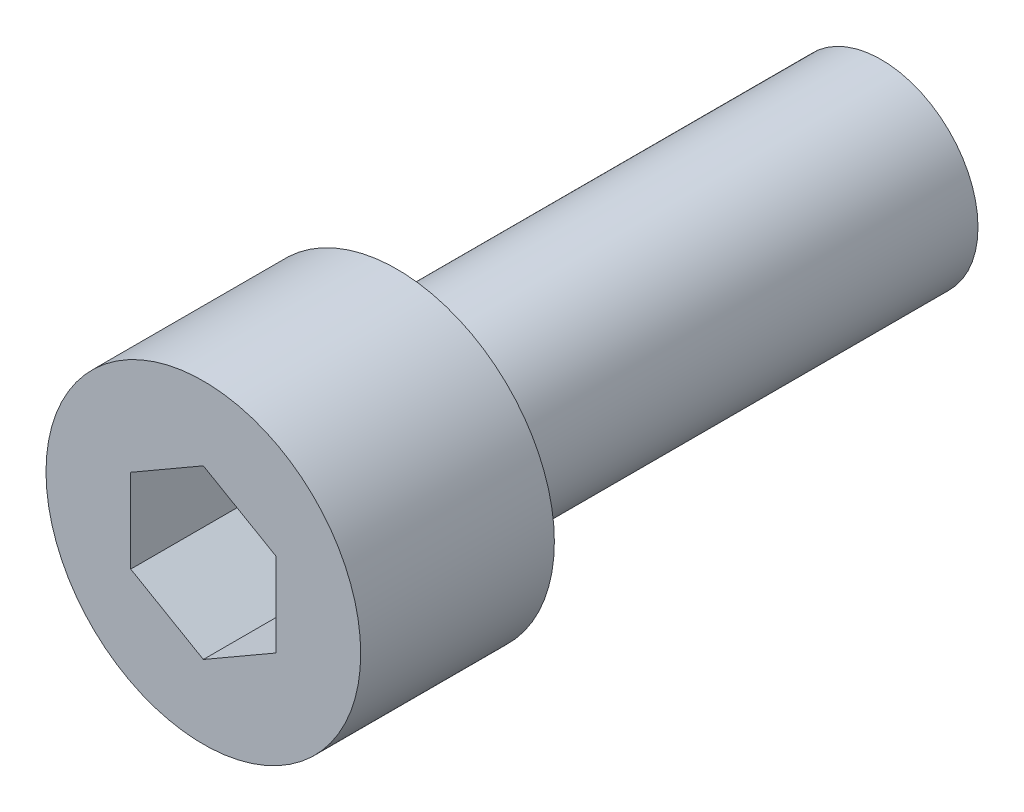
ISO-10303-21;
HEADER;
FILE_DESCRIPTION(('STEP AP214'),'2;1');
FILE_NAME('part.step','',(''),(''),'','','');
FILE_SCHEMA(('AUTOMOTIVE_DESIGN { 1 0 10303 214 1 1 1 1 }'));
ENDSEC;
DATA;
#1=APPLICATION_CONTEXT('core data for automotive mechanical design processes');
#2=APPLICATION_PROTOCOL_DEFINITION('international standard','automotive_design',2000,#1);
#3=PRODUCT_CONTEXT('',#1,'mechanical');
#4=PRODUCT('Part','Part','',(#3));
#5=PRODUCT_RELATED_PRODUCT_CATEGORY('part','',(#4));
#6=PRODUCT_DEFINITION_FORMATION('','',#4);
#7=PRODUCT_DEFINITION_CONTEXT('part definition',#1,'design');
#8=PRODUCT_DEFINITION('design','',#6,#7);
#9=PRODUCT_DEFINITION_SHAPE('','',#8);
#10=(LENGTH_UNIT() NAMED_UNIT(*) SI_UNIT(.MILLI.,.METRE.));
#11=(NAMED_UNIT(*) PLANE_ANGLE_UNIT() SI_UNIT($,.RADIAN.));
#12=(NAMED_UNIT(*) SI_UNIT($,.STERADIAN.) SOLID_ANGLE_UNIT());
#13=UNCERTAINTY_MEASURE_WITH_UNIT(LENGTH_MEASURE(1.E-05),#10,'distance_accuracy_value','');
#14=(GEOMETRIC_REPRESENTATION_CONTEXT(3) GLOBAL_UNCERTAINTY_ASSIGNED_CONTEXT((#13)) GLOBAL_UNIT_ASSIGNED_CONTEXT((#10,
#11,#12)) REPRESENTATION_CONTEXT('',''));
#15=CARTESIAN_POINT('',(0.,0.,0.));
#16=DIRECTION('',(0.,0.,1.));
#17=DIRECTION('',(1.,0.,0.));
#18=AXIS2_PLACEMENT_3D('',#15,#16,#17);
#19=CARTESIAN_POINT('',(0.,0.,0.));
#20=DIRECTION('',(0.,0.,-1.));
#21=DIRECTION('',(-1.,0.,0.));
#22=AXIS2_PLACEMENT_3D('',#19,#20,#21);
#23=PLANE('',#22);
#24=DIRECTION('',(0.866025403784439,-0.5,0.));
#25=VECTOR('',#24,1.);
#26=CARTESIAN_POINT('',(-3.,-1.73205080756888,0.));
#27=LINE('',#26,#25);
#28=CARTESIAN_POINT('',(-3.,-1.73205080756888,0.));
#29=VERTEX_POINT('',#28);
#30=CARTESIAN_POINT('',(0.,-3.46410161513776,0.));
#31=VERTEX_POINT('',#30);
#32=EDGE_CURVE('E123',#29,#31,#27,.T.);
#33=ORIENTED_EDGE('',*,*,#32,.F.);
#34=DIRECTION('',(0.,-1.,0.));
#35=VECTOR('',#34,1.);
#36=CARTESIAN_POINT('',(-3.,1.73205080756888,0.));
#37=LINE('',#36,#35);
#38=CARTESIAN_POINT('',(-3.,1.73205080756888,0.));
#39=VERTEX_POINT('',#38);
#40=EDGE_CURVE('E49',#39,#29,#37,.T.);
#41=ORIENTED_EDGE('',*,*,#40,.F.);
#42=DIRECTION('',(-0.866025403784439,-0.5,0.));
#43=VECTOR('',#42,1.);
#44=CARTESIAN_POINT('',(0.,3.46410161513776,0.));
#45=LINE('',#44,#43);
#46=CARTESIAN_POINT('',(0.,3.46410161513776,0.));
#47=VERTEX_POINT('',#46);
#48=EDGE_CURVE('E132',#47,#39,#45,.T.);
#49=ORIENTED_EDGE('',*,*,#48,.F.);
#50=DIRECTION('',(-0.866025403784439,0.5,0.));
#51=VECTOR('',#50,1.);
#52=CARTESIAN_POINT('',(3.,1.73205080756888,0.));
#53=LINE('',#52,#51);
#54=CARTESIAN_POINT('',(3.,1.73205080756888,0.));
#55=VERTEX_POINT('',#54);
#56=EDGE_CURVE('E130',#55,#47,#53,.T.);
#57=ORIENTED_EDGE('',*,*,#56,.F.);
#58=DIRECTION('',(0.,1.,0.));
#59=VECTOR('',#58,1.);
#60=CARTESIAN_POINT('',(3.,-1.73205080756888,0.));
#61=LINE('',#60,#59);
#62=CARTESIAN_POINT('',(3.,-1.73205080756888,0.));
#63=VERTEX_POINT('',#62);
#64=EDGE_CURVE('E97',#63,#55,#61,.T.);
#65=ORIENTED_EDGE('',*,*,#64,.F.);
#66=DIRECTION('',(0.866025403784439,0.5,0.));
#67=VECTOR('',#66,1.);
#68=CARTESIAN_POINT('',(0.,-3.46410161513776,0.));
#69=LINE('',#68,#67);
#70=EDGE_CURVE('E126',#31,#63,#69,.T.);
#71=ORIENTED_EDGE('',*,*,#70,.F.);
#72=EDGE_LOOP('',(#33,#41,#49,#57,#65,#71));
#73=FACE_BOUND('',#72,.T.);
#74=CARTESIAN_POINT('',(0.,0.,0.));
#75=DIRECTION('',(0.,0.,1.));
#76=DIRECTION('',(1.,0.,0.));
#77=AXIS2_PLACEMENT_3D('',#74,#75,#76);
#78=CIRCLE('',#77,6.5);
#79=CARTESIAN_POINT('',(6.5,0.,0.));
#80=VERTEX_POINT('',#79);
#81=EDGE_CURVE('E11',#80,#80,#78,.T.);
#82=ORIENTED_EDGE('',*,*,#81,.T.);
#83=EDGE_LOOP('',(#82));
#84=FACE_BOUND('',#83,.T.);
#85=ADVANCED_FACE('F35',(#73,#84),#23,.F.);
#86=CARTESIAN_POINT('',(0.,0.,0.));
#87=DIRECTION('',(0.,0.,1.));
#88=DIRECTION('',(1.,0.,0.));
#89=AXIS2_PLACEMENT_3D('',#86,#87,#88);
#90=CYLINDRICAL_SURFACE('',#89,6.5);
#91=ORIENTED_EDGE('',*,*,#81,.F.);
#92=EDGE_LOOP('',(#91));
#93=FACE_BOUND('',#92,.T.);
#94=CARTESIAN_POINT('',(0.,0.,-8.));
#95=DIRECTION('',(0.,0.,1.));
#96=DIRECTION('',(1.,0.,0.));
#97=AXIS2_PLACEMENT_3D('',#94,#95,#96);
#98=CIRCLE('',#97,6.5);
#99=CARTESIAN_POINT('',(6.5,0.,-8.));
#100=VERTEX_POINT('',#99);
#101=EDGE_CURVE('E42',#100,#100,#98,.T.);
#102=ORIENTED_EDGE('',*,*,#101,.T.);
#103=EDGE_LOOP('',(#102));
#104=FACE_BOUND('',#103,.T.);
#105=ADVANCED_FACE('F149',(#93,#104),#90,.T.);
#106=CARTESIAN_POINT('',(0.,6.5,-8.));
#107=DIRECTION('',(0.,0.,1.));
#108=DIRECTION('',(1.,0.,0.));
#109=AXIS2_PLACEMENT_3D('',#106,#107,#108);
#110=PLANE('',#109);
#111=ORIENTED_EDGE('',*,*,#101,.F.);
#112=EDGE_LOOP('',(#111));
#113=FACE_BOUND('',#112,.T.);
#114=CARTESIAN_POINT('',(0.,0.,-8.));
#115=DIRECTION('',(0.,0.,1.));
#116=DIRECTION('',(1.,0.,0.));
#117=AXIS2_PLACEMENT_3D('',#114,#115,#116);
#118=CIRCLE('',#117,4.);
#119=CARTESIAN_POINT('',(4.,0.,-8.));
#120=VERTEX_POINT('',#119);
#121=EDGE_CURVE('E144',#120,#120,#118,.T.);
#122=ORIENTED_EDGE('',*,*,#121,.T.);
#123=EDGE_LOOP('',(#122));
#124=FACE_BOUND('',#123,.T.);
#125=ADVANCED_FACE('F151',(#113,#124),#110,.F.);
#126=CARTESIAN_POINT('',(0.,0.,0.));
#127=DIRECTION('',(0.,0.,1.));
#128=DIRECTION('',(1.,0.,0.));
#129=AXIS2_PLACEMENT_3D('',#126,#127,#128);
#130=CYLINDRICAL_SURFACE('',#129,4.);
#131=ORIENTED_EDGE('',*,*,#121,.F.);
#132=EDGE_LOOP('',(#131));
#133=FACE_BOUND('',#132,.T.);
#134=CARTESIAN_POINT('',(0.,0.,-28.));
#135=DIRECTION('',(0.,0.,1.));
#136=DIRECTION('',(1.,0.,0.));
#137=AXIS2_PLACEMENT_3D('',#134,#135,#136);
#138=CIRCLE('',#137,4.);
#139=CARTESIAN_POINT('',(4.,0.,-28.));
#140=VERTEX_POINT('',#139);
#141=EDGE_CURVE('E136',#140,#140,#138,.T.);
#142=ORIENTED_EDGE('',*,*,#141,.T.);
#143=EDGE_LOOP('',(#142));
#144=FACE_BOUND('',#143,.T.);
#145=ADVANCED_FACE('F154',(#133,#144),#130,.T.);
#146=CARTESIAN_POINT('',(0.,4.,-28.));
#147=DIRECTION('',(0.,0.,1.));
#148=DIRECTION('',(1.,0.,0.));
#149=AXIS2_PLACEMENT_3D('',#146,#147,#148);
#150=PLANE('',#149);
#151=ORIENTED_EDGE('',*,*,#141,.F.);
#152=EDGE_LOOP('',(#151));
#153=FACE_BOUND('',#152,.T.);
#154=ADVANCED_FACE('F160',(#153),#150,.F.);
#155=CARTESIAN_POINT('',(-3.,1.73205080756888,-6.));
#156=DIRECTION('',(-1.,0.,0.));
#157=DIRECTION('',(0.,0.,1.));
#158=AXIS2_PLACEMENT_3D('',#155,#156,#157);
#159=PLANE('',#158);
#160=ORIENTED_EDGE('',*,*,#40,.T.);
#161=DIRECTION('',(0.,0.,1.));
#162=VECTOR('',#161,1.);
#163=CARTESIAN_POINT('',(-3.,-1.73205080756888,-6.));
#164=LINE('',#163,#162);
#165=CARTESIAN_POINT('',(-3.,-1.73205080756888,-6.));
#166=VERTEX_POINT('',#165);
#167=EDGE_CURVE('E79',#166,#29,#164,.T.);
#168=ORIENTED_EDGE('',*,*,#167,.F.);
#169=DIRECTION('',(0.,-1.,0.));
#170=VECTOR('',#169,1.);
#171=CARTESIAN_POINT('',(-3.,1.73205080756888,-6.));
#172=LINE('',#171,#170);
#173=CARTESIAN_POINT('',(-3.,1.73205080756888,-6.));
#174=VERTEX_POINT('',#173);
#175=EDGE_CURVE('E134',#174,#166,#172,.T.);
#176=ORIENTED_EDGE('',*,*,#175,.F.);
#177=DIRECTION('',(0.,0.,1.));
#178=VECTOR('',#177,1.);
#179=CARTESIAN_POINT('',(-3.,1.73205080756888,-6.));
#180=LINE('',#179,#178);
#181=EDGE_CURVE('E57',#174,#39,#180,.T.);
#182=ORIENTED_EDGE('',*,*,#181,.T.);
#183=EDGE_LOOP('',(#160,#168,#176,#182));
#184=FACE_BOUND('',#183,.T.);
#185=ADVANCED_FACE('F165',(#184),#159,.F.);
#186=CARTESIAN_POINT('',(0.,3.46410161513776,-6.));
#187=DIRECTION('',(-0.5,0.866025403784439,0.));
#188=DIRECTION('',(-0.866025403784439,-0.5,0.));
#189=AXIS2_PLACEMENT_3D('',#186,#187,#188);
#190=PLANE('',#189);
#191=ORIENTED_EDGE('',*,*,#48,.T.);
#192=ORIENTED_EDGE('',*,*,#181,.F.);
#193=DIRECTION('',(-0.866025403784439,-0.5,0.));
#194=VECTOR('',#193,1.);
#195=CARTESIAN_POINT('',(0.,3.46410161513776,-6.));
#196=LINE('',#195,#194);
#197=CARTESIAN_POINT('',(0.,3.46410161513776,-6.));
#198=VERTEX_POINT('',#197);
#199=EDGE_CURVE('E109',#198,#174,#196,.T.);
#200=ORIENTED_EDGE('',*,*,#199,.F.);
#201=DIRECTION('',(0.,0.,1.));
#202=VECTOR('',#201,1.);
#203=CARTESIAN_POINT('',(0.,3.46410161513776,-6.));
#204=LINE('',#203,#202);
#205=EDGE_CURVE('E101',#198,#47,#204,.T.);
#206=ORIENTED_EDGE('',*,*,#205,.T.);
#207=EDGE_LOOP('',(#191,#192,#200,#206));
#208=FACE_BOUND('',#207,.T.);
#209=ADVANCED_FACE('F170',(#208),#190,.F.);
#210=CARTESIAN_POINT('',(3.,1.73205080756888,-6.));
#211=DIRECTION('',(0.5,0.866025403784439,0.));
#212=DIRECTION('',(-0.866025403784439,0.5,0.));
#213=AXIS2_PLACEMENT_3D('',#210,#211,#212);
#214=PLANE('',#213);
#215=ORIENTED_EDGE('',*,*,#56,.T.);
#216=ORIENTED_EDGE('',*,*,#205,.F.);
#217=DIRECTION('',(-0.866025403784439,0.5,0.));
#218=VECTOR('',#217,1.);
#219=CARTESIAN_POINT('',(3.,1.73205080756888,-6.));
#220=LINE('',#219,#218);
#221=CARTESIAN_POINT('',(3.,1.73205080756888,-6.));
#222=VERTEX_POINT('',#221);
#223=EDGE_CURVE('E105',#222,#198,#220,.T.);
#224=ORIENTED_EDGE('',*,*,#223,.F.);
#225=DIRECTION('',(0.,0.,1.));
#226=VECTOR('',#225,1.);
#227=CARTESIAN_POINT('',(3.,1.73205080756888,-6.));
#228=LINE('',#227,#226);
#229=EDGE_CURVE('E90',#222,#55,#228,.T.);
#230=ORIENTED_EDGE('',*,*,#229,.T.);
#231=EDGE_LOOP('',(#215,#216,#224,#230));
#232=FACE_BOUND('',#231,.T.);
#233=ADVANCED_FACE('F106',(#232),#214,.F.);
#234=CARTESIAN_POINT('',(3.,-1.73205080756888,-6.));
#235=DIRECTION('',(1.,0.,0.));
#236=DIRECTION('',(0.,1.,0.));
#237=AXIS2_PLACEMENT_3D('',#234,#235,#236);
#238=PLANE('',#237);
#239=ORIENTED_EDGE('',*,*,#64,.T.);
#240=ORIENTED_EDGE('',*,*,#229,.F.);
#241=DIRECTION('',(0.,1.,0.));
#242=VECTOR('',#241,1.);
#243=CARTESIAN_POINT('',(3.,-1.73205080756888,-6.));
#244=LINE('',#243,#242);
#245=CARTESIAN_POINT('',(3.,-1.73205080756888,-6.));
#246=VERTEX_POINT('',#245);
#247=EDGE_CURVE('E94',#246,#222,#244,.T.);
#248=ORIENTED_EDGE('',*,*,#247,.F.);
#249=DIRECTION('',(0.,0.,1.));
#250=VECTOR('',#249,1.);
#251=CARTESIAN_POINT('',(3.,-1.73205080756888,-6.));
#252=LINE('',#251,#250);
#253=EDGE_CURVE('E102',#246,#63,#252,.T.);
#254=ORIENTED_EDGE('',*,*,#253,.T.);
#255=EDGE_LOOP('',(#239,#240,#248,#254));
#256=FACE_BOUND('',#255,.T.);
#257=ADVANCED_FACE('F92',(#256),#238,.F.);
#258=CARTESIAN_POINT('',(0.,-3.46410161513776,-6.));
#259=DIRECTION('',(0.5,-0.866025403784438,0.));
#260=DIRECTION('',(0.866025403784439,0.5,0.));
#261=AXIS2_PLACEMENT_3D('',#258,#259,#260);
#262=PLANE('',#261);
#263=ORIENTED_EDGE('',*,*,#70,.T.);
#264=ORIENTED_EDGE('',*,*,#253,.F.);
#265=DIRECTION('',(0.866025403784439,0.5,0.));
#266=VECTOR('',#265,1.);
#267=CARTESIAN_POINT('',(0.,-3.46410161513776,-6.));
#268=LINE('',#267,#266);
#269=CARTESIAN_POINT('',(0.,-3.46410161513776,-6.));
#270=VERTEX_POINT('',#269);
#271=EDGE_CURVE('E115',#270,#246,#268,.T.);
#272=ORIENTED_EDGE('',*,*,#271,.F.);
#273=DIRECTION('',(0.,0.,1.));
#274=VECTOR('',#273,1.);
#275=CARTESIAN_POINT('',(0.,-3.46410161513776,-6.));
#276=LINE('',#275,#274);
#277=EDGE_CURVE('E139',#270,#31,#276,.T.);
#278=ORIENTED_EDGE('',*,*,#277,.T.);
#279=EDGE_LOOP('',(#263,#264,#272,#278));
#280=FACE_BOUND('',#279,.T.);
#281=ADVANCED_FACE('F196',(#280),#262,.F.);
#282=CARTESIAN_POINT('',(-3.,-1.73205080756888,-6.));
#283=DIRECTION('',(-0.5,-0.866025403784438,0.));
#284=DIRECTION('',(0.866025403784439,-0.5,0.));
#285=AXIS2_PLACEMENT_3D('',#282,#283,#284);
#286=PLANE('',#285);
#287=ORIENTED_EDGE('',*,*,#32,.T.);
#288=ORIENTED_EDGE('',*,*,#277,.F.);
#289=DIRECTION('',(0.866025403784439,-0.5,0.));
#290=VECTOR('',#289,1.);
#291=CARTESIAN_POINT('',(-3.,-1.73205080756888,-6.));
#292=LINE('',#291,#290);
#293=EDGE_CURVE('E117',#166,#270,#292,.T.);
#294=ORIENTED_EDGE('',*,*,#293,.F.);
#295=ORIENTED_EDGE('',*,*,#167,.T.);
#296=EDGE_LOOP('',(#287,#288,#294,#295));
#297=FACE_BOUND('',#296,.T.);
#298=ADVANCED_FACE('F184',(#297),#286,.F.);
#299=CARTESIAN_POINT('',(0.,0.,-6.));
#300=DIRECTION('',(0.,0.,1.));
#301=DIRECTION('',(1.,0.,0.));
#302=AXIS2_PLACEMENT_3D('',#299,#300,#301);
#303=PLANE('',#302);
#304=ORIENTED_EDGE('',*,*,#175,.T.);
#305=ORIENTED_EDGE('',*,*,#293,.T.);
#306=ORIENTED_EDGE('',*,*,#271,.T.);
#307=ORIENTED_EDGE('',*,*,#247,.T.);
#308=ORIENTED_EDGE('',*,*,#223,.T.);
#309=ORIENTED_EDGE('',*,*,#199,.T.);
#310=EDGE_LOOP('',(#304,#305,#306,#307,#308,#309));
#311=FACE_BOUND('',#310,.T.);
#312=ADVANCED_FACE('F112',(#311),#303,.T.);
#313=CLOSED_SHELL('',(#85,#105,#125,#145,#154,#185,#209,#233,#257,#281,#298,#312));
#314=MANIFOLD_SOLID_BREP('B2',#313);
#315=ADVANCED_BREP_SHAPE_REPRESENTATION('',(#18,#314),#14);
#316=SHAPE_DEFINITION_REPRESENTATION(#9,#315);
ENDSEC;
END-ISO-10303-21;
